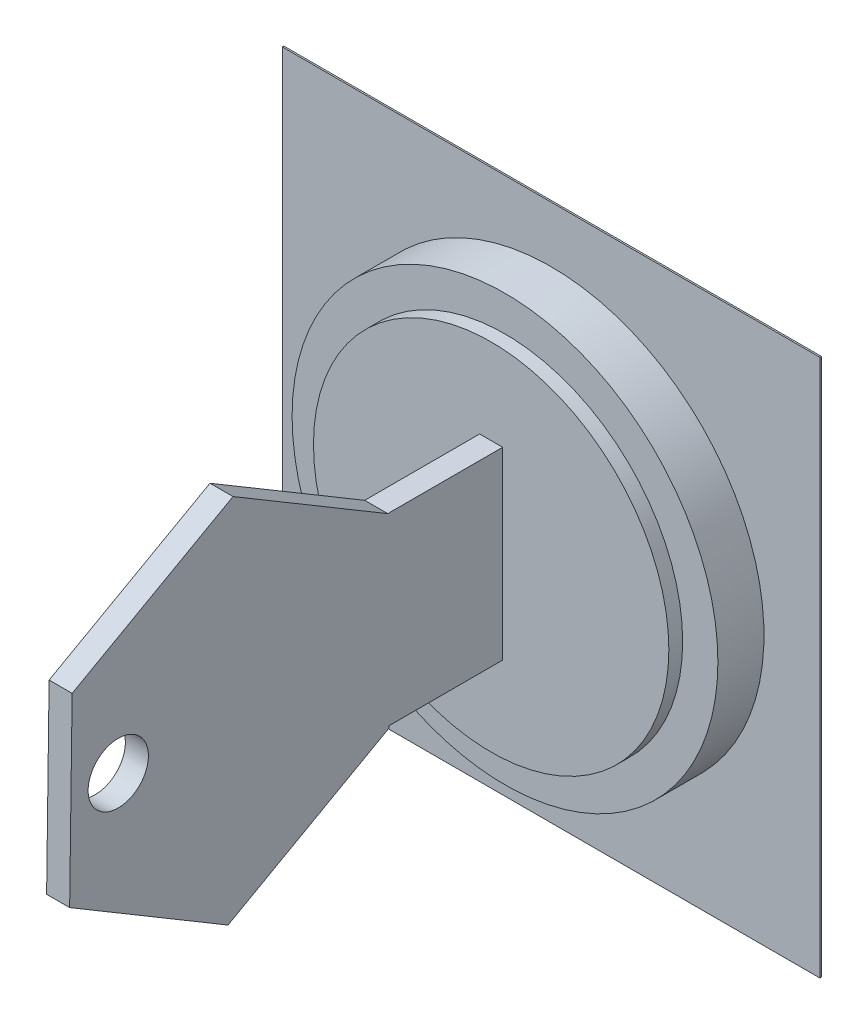
ISO-10303-21;
HEADER;
FILE_DESCRIPTION(('STEP AP214'),'2;1');
FILE_NAME('part.step','',(''),(''),'','','');
FILE_SCHEMA(('AUTOMOTIVE_DESIGN { 1 0 10303 214 1 1 1 1 }'));
ENDSEC;
DATA;
#1=APPLICATION_CONTEXT('core data for automotive mechanical design processes');
#2=APPLICATION_PROTOCOL_DEFINITION('international standard','automotive_design',2000,#1);
#3=PRODUCT_CONTEXT('',#1,'mechanical');
#4=PRODUCT('Part','Part','',(#3));
#5=PRODUCT_RELATED_PRODUCT_CATEGORY('part','',(#4));
#6=PRODUCT_DEFINITION_FORMATION('','',#4);
#7=PRODUCT_DEFINITION_CONTEXT('part definition',#1,'design');
#8=PRODUCT_DEFINITION('design','',#6,#7);
#9=PRODUCT_DEFINITION_SHAPE('','',#8);
#10=(LENGTH_UNIT() NAMED_UNIT(*) SI_UNIT(.MILLI.,.METRE.));
#11=(NAMED_UNIT(*) PLANE_ANGLE_UNIT() SI_UNIT($,.RADIAN.));
#12=(NAMED_UNIT(*) SI_UNIT($,.STERADIAN.) SOLID_ANGLE_UNIT());
#13=UNCERTAINTY_MEASURE_WITH_UNIT(LENGTH_MEASURE(1.E-05),#10,'distance_accuracy_value','');
#14=(GEOMETRIC_REPRESENTATION_CONTEXT(3) GLOBAL_UNCERTAINTY_ASSIGNED_CONTEXT((#13)) GLOBAL_UNIT_ASSIGNED_CONTEXT((#10,
#11,#12)) REPRESENTATION_CONTEXT('',''));
#15=CARTESIAN_POINT('',(0.,0.,0.));
#16=DIRECTION('',(0.,0.,1.));
#17=DIRECTION('',(1.,0.,0.));
#18=AXIS2_PLACEMENT_3D('',#15,#16,#17);
#19=CARTESIAN_POINT('',(0.,0.,4.));
#20=DIRECTION('',(0.,0.,1.));
#21=DIRECTION('',(1.,0.,0.));
#22=AXIS2_PLACEMENT_3D('',#19,#20,#21);
#23=PLANE('',#22);
#24=CARTESIAN_POINT('',(0.,0.,4.));
#25=DIRECTION('',(0.,0.,-1.));
#26=DIRECTION('',(-1.,0.,0.));
#27=AXIS2_PLACEMENT_3D('',#24,#25,#26);
#28=CIRCLE('',#27,11.5685683386056);
#29=CARTESIAN_POINT('',(-11.5685683386056,0.,4.));
#30=VERTEX_POINT('',#29);
#31=EDGE_CURVE('E203',#30,#30,#28,.T.);
#32=ORIENTED_EDGE('',*,*,#31,.F.);
#33=EDGE_LOOP('',(#32));
#34=FACE_BOUND('',#33,.T.);
#35=DIRECTION('',(-1.,0.,0.));
#36=VECTOR('',#35,1.);
#37=CARTESIAN_POINT('',(-0.75,6.,4.));
#38=LINE('',#37,#36);
#39=CARTESIAN_POINT('',(0.75,6.,4.));
#40=VERTEX_POINT('',#39);
#41=CARTESIAN_POINT('',(-0.75,6.,4.));
#42=VERTEX_POINT('',#41);
#43=EDGE_CURVE('E188',#40,#42,#38,.T.);
#44=ORIENTED_EDGE('',*,*,#43,.F.);
#45=DIRECTION('',(0.,1.,0.));
#46=VECTOR('',#45,1.);
#47=CARTESIAN_POINT('',(0.75,-6.,4.));
#48=LINE('',#47,#46);
#49=CARTESIAN_POINT('',(0.75,-6.,4.));
#50=VERTEX_POINT('',#49);
#51=EDGE_CURVE('E185',#50,#40,#48,.T.);
#52=ORIENTED_EDGE('',*,*,#51,.F.);
#53=DIRECTION('',(1.,0.,0.));
#54=VECTOR('',#53,1.);
#55=CARTESIAN_POINT('',(-0.75,-6.,4.));
#56=LINE('',#55,#54);
#57=CARTESIAN_POINT('',(-0.75,-6.,4.));
#58=VERTEX_POINT('',#57);
#59=EDGE_CURVE('E193',#58,#50,#56,.T.);
#60=ORIENTED_EDGE('',*,*,#59,.F.);
#61=DIRECTION('',(0.,-1.,0.));
#62=VECTOR('',#61,1.);
#63=CARTESIAN_POINT('',(-0.75,-6.,4.));
#64=LINE('',#63,#62);
#65=EDGE_CURVE('E190',#42,#58,#64,.T.);
#66=ORIENTED_EDGE('',*,*,#65,.F.);
#67=EDGE_LOOP('',(#44,#52,#60,#66));
#68=FACE_BOUND('',#67,.T.);
#69=ADVANCED_FACE('F35',(#34,#68),#23,.T.);
#70=CARTESIAN_POINT('',(17.5,-17.5,0.1));
#71=DIRECTION('',(-1.,0.,0.));
#72=DIRECTION('',(0.,0.,1.));
#73=AXIS2_PLACEMENT_3D('',#70,#71,#72);
#74=PLANE('',#73);
#75=DIRECTION('',(0.,1.,0.));
#76=VECTOR('',#75,1.);
#77=CARTESIAN_POINT('',(17.5,-17.5,0.));
#78=LINE('',#77,#76);
#79=CARTESIAN_POINT('',(17.5,-17.5,0.));
#80=VERTEX_POINT('',#79);
#81=CARTESIAN_POINT('',(17.5,17.5,0.));
#82=VERTEX_POINT('',#81);
#83=EDGE_CURVE('E210',#80,#82,#78,.T.);
#84=ORIENTED_EDGE('',*,*,#83,.T.);
#85=DIRECTION('',(0.,0.,-1.));
#86=VECTOR('',#85,1.);
#87=CARTESIAN_POINT('',(17.5,17.5,0.1));
#88=LINE('',#87,#86);
#89=CARTESIAN_POINT('',(17.5,17.5,0.1));
#90=VERTEX_POINT('',#89);
#91=EDGE_CURVE('E237',#90,#82,#88,.T.);
#92=ORIENTED_EDGE('',*,*,#91,.F.);
#93=DIRECTION('',(0.,1.,0.));
#94=VECTOR('',#93,1.);
#95=CARTESIAN_POINT('',(17.5,-17.5,0.1));
#96=LINE('',#95,#94);
#97=CARTESIAN_POINT('',(17.5,-17.5,0.1));
#98=VERTEX_POINT('',#97);
#99=EDGE_CURVE('E211',#98,#90,#96,.T.);
#100=ORIENTED_EDGE('',*,*,#99,.F.);
#101=DIRECTION('',(0.,0.,-1.));
#102=VECTOR('',#101,1.);
#103=CARTESIAN_POINT('',(17.5,-17.5,0.1));
#104=LINE('',#103,#102);
#105=EDGE_CURVE('E221',#98,#80,#104,.T.);
#106=ORIENTED_EDGE('',*,*,#105,.T.);
#107=EDGE_LOOP('',(#84,#92,#100,#106));
#108=FACE_BOUND('',#107,.T.);
#109=ADVANCED_FACE('F37',(#108),#74,.F.);
#110=CARTESIAN_POINT('',(-17.5,17.5,0.1));
#111=DIRECTION('',(0.,-1.,0.));
#112=DIRECTION('',(0.,0.,-1.));
#113=AXIS2_PLACEMENT_3D('',#110,#111,#112);
#114=PLANE('',#113);
#115=DIRECTION('',(-1.,0.,0.));
#116=VECTOR('',#115,1.);
#117=CARTESIAN_POINT('',(-17.5,17.5,0.));
#118=LINE('',#117,#116);
#119=CARTESIAN_POINT('',(-17.5,17.5,0.));
#120=VERTEX_POINT('',#119);
#121=EDGE_CURVE('E224',#82,#120,#118,.T.);
#122=ORIENTED_EDGE('',*,*,#121,.T.);
#123=DIRECTION('',(0.,0.,-1.));
#124=VECTOR('',#123,1.);
#125=CARTESIAN_POINT('',(-17.5,17.5,0.1));
#126=LINE('',#125,#124);
#127=CARTESIAN_POINT('',(-17.5,17.5,0.1));
#128=VERTEX_POINT('',#127);
#129=EDGE_CURVE('E234',#128,#120,#126,.T.);
#130=ORIENTED_EDGE('',*,*,#129,.F.);
#131=DIRECTION('',(-1.,0.,0.));
#132=VECTOR('',#131,1.);
#133=CARTESIAN_POINT('',(-17.5,17.5,0.1));
#134=LINE('',#133,#132);
#135=EDGE_CURVE('E214',#90,#128,#134,.T.);
#136=ORIENTED_EDGE('',*,*,#135,.F.);
#137=ORIENTED_EDGE('',*,*,#91,.T.);
#138=EDGE_LOOP('',(#122,#130,#136,#137));
#139=FACE_BOUND('',#138,.T.);
#140=ADVANCED_FACE('F316',(#139),#114,.F.);
#141=CARTESIAN_POINT('',(-17.5,-17.5,0.1));
#142=DIRECTION('',(1.,0.,0.));
#143=DIRECTION('',(0.,0.,-1.));
#144=AXIS2_PLACEMENT_3D('',#141,#142,#143);
#145=PLANE('',#144);
#146=DIRECTION('',(0.,-1.,0.));
#147=VECTOR('',#146,1.);
#148=CARTESIAN_POINT('',(-17.5,-17.5,0.));
#149=LINE('',#148,#147);
#150=CARTESIAN_POINT('',(-17.5,-17.5,0.));
#151=VERTEX_POINT('',#150);
#152=EDGE_CURVE('E226',#120,#151,#149,.T.);
#153=ORIENTED_EDGE('',*,*,#152,.T.);
#154=DIRECTION('',(0.,0.,-1.));
#155=VECTOR('',#154,1.);
#156=CARTESIAN_POINT('',(-17.5,-17.5,0.1));
#157=LINE('',#156,#155);
#158=CARTESIAN_POINT('',(-17.5,-17.5,0.1));
#159=VERTEX_POINT('',#158);
#160=EDGE_CURVE('E231',#159,#151,#157,.T.);
#161=ORIENTED_EDGE('',*,*,#160,.F.);
#162=DIRECTION('',(0.,-1.,0.));
#163=VECTOR('',#162,1.);
#164=CARTESIAN_POINT('',(-17.5,-17.5,0.1));
#165=LINE('',#164,#163);
#166=EDGE_CURVE('E217',#128,#159,#165,.T.);
#167=ORIENTED_EDGE('',*,*,#166,.F.);
#168=ORIENTED_EDGE('',*,*,#129,.T.);
#169=EDGE_LOOP('',(#153,#161,#167,#168));
#170=FACE_BOUND('',#169,.T.);
#171=ADVANCED_FACE('F313',(#170),#145,.F.);
#172=CARTESIAN_POINT('',(-17.5,-17.5,0.1));
#173=DIRECTION('',(0.,1.,0.));
#174=DIRECTION('',(0.,0.,1.));
#175=AXIS2_PLACEMENT_3D('',#172,#173,#174);
#176=PLANE('',#175);
#177=DIRECTION('',(1.,0.,0.));
#178=VECTOR('',#177,1.);
#179=CARTESIAN_POINT('',(-17.5,-17.5,0.));
#180=LINE('',#179,#178);
#181=EDGE_CURVE('E215',#151,#80,#180,.T.);
#182=ORIENTED_EDGE('',*,*,#181,.T.);
#183=ORIENTED_EDGE('',*,*,#105,.F.);
#184=DIRECTION('',(1.,0.,0.));
#185=VECTOR('',#184,1.);
#186=CARTESIAN_POINT('',(-17.5,-17.5,0.1));
#187=LINE('',#186,#185);
#188=EDGE_CURVE('E219',#159,#98,#187,.T.);
#189=ORIENTED_EDGE('',*,*,#188,.F.);
#190=ORIENTED_EDGE('',*,*,#160,.T.);
#191=EDGE_LOOP('',(#182,#183,#189,#190));
#192=FACE_BOUND('',#191,.T.);
#193=ADVANCED_FACE('F306',(#192),#176,.F.);
#194=CARTESIAN_POINT('',(0.,0.,0.1));
#195=DIRECTION('',(0.,0.,-1.));
#196=DIRECTION('',(-1.,0.,0.));
#197=AXIS2_PLACEMENT_3D('',#194,#195,#196);
#198=PLANE('',#197);
#199=CARTESIAN_POINT('',(0.,0.,0.0999999999999998));
#200=DIRECTION('',(0.,0.,-1.));
#201=DIRECTION('',(-1.,0.,0.));
#202=AXIS2_PLACEMENT_3D('',#199,#200,#201);
#203=CIRCLE('',#202,13.8612305493775);
#204=CARTESIAN_POINT('',(-13.8612305493775,0.,0.0999999999999998));
#205=VERTEX_POINT('',#204);
#206=EDGE_CURVE('E43',#205,#205,#203,.F.);
#207=ORIENTED_EDGE('',*,*,#206,.F.);
#208=EDGE_LOOP('',(#207));
#209=FACE_BOUND('',#208,.T.);
#210=ORIENTED_EDGE('',*,*,#99,.T.);
#211=ORIENTED_EDGE('',*,*,#135,.T.);
#212=ORIENTED_EDGE('',*,*,#166,.T.);
#213=ORIENTED_EDGE('',*,*,#188,.T.);
#214=EDGE_LOOP('',(#210,#211,#212,#213));
#215=FACE_BOUND('',#214,.T.);
#216=ADVANCED_FACE('F303',(#209,#215),#198,.F.);
#217=CARTESIAN_POINT('',(0.,0.,0.));
#218=DIRECTION('',(0.,0.,-1.));
#219=DIRECTION('',(-1.,0.,0.));
#220=AXIS2_PLACEMENT_3D('',#217,#218,#219);
#221=PLANE('',#220);
#222=ORIENTED_EDGE('',*,*,#83,.F.);
#223=ORIENTED_EDGE('',*,*,#181,.F.);
#224=ORIENTED_EDGE('',*,*,#152,.F.);
#225=ORIENTED_EDGE('',*,*,#121,.F.);
#226=EDGE_LOOP('',(#222,#223,#224,#225));
#227=FACE_BOUND('',#226,.T.);
#228=ADVANCED_FACE('F301',(#227),#221,.T.);
#229=CARTESIAN_POINT('',(0.,0.,3.1));
#230=DIRECTION('',(0.,0.,-1.));
#231=DIRECTION('',(-1.,0.,0.));
#232=AXIS2_PLACEMENT_3D('',#229,#230,#231);
#233=CYLINDRICAL_SURFACE('',#232,13.8612305493775);
#234=CARTESIAN_POINT('',(0.,0.,3.1));
#235=DIRECTION('',(0.,0.,1.));
#236=DIRECTION('',(1.,0.,0.));
#237=AXIS2_PLACEMENT_3D('',#234,#235,#236);
#238=CIRCLE('',#237,13.8612305493775);
#239=CARTESIAN_POINT('',(13.8612305493775,0.,3.1));
#240=VERTEX_POINT('',#239);
#241=EDGE_CURVE('E207',#240,#240,#238,.T.);
#242=ORIENTED_EDGE('',*,*,#241,.F.);
#243=EDGE_LOOP('',(#242));
#244=FACE_BOUND('',#243,.T.);
#245=ORIENTED_EDGE('',*,*,#206,.T.);
#246=EDGE_LOOP('',(#245));
#247=FACE_BOUND('',#246,.T.);
#248=ADVANCED_FACE('F298',(#244,#247),#233,.T.);
#249=CARTESIAN_POINT('',(0.,0.,3.1));
#250=DIRECTION('',(0.,0.,1.));
#251=DIRECTION('',(1.,0.,0.));
#252=AXIS2_PLACEMENT_3D('',#249,#250,#251);
#253=PLANE('',#252);
#254=CARTESIAN_POINT('',(0.,0.,3.1));
#255=DIRECTION('',(0.,0.,1.));
#256=DIRECTION('',(1.,0.,0.));
#257=AXIS2_PLACEMENT_3D('',#254,#255,#256);
#258=CIRCLE('',#257,11.5685683386056);
#259=CARTESIAN_POINT('',(11.5685683386056,0.,3.1));
#260=VERTEX_POINT('',#259);
#261=EDGE_CURVE('E206',#260,#260,#258,.F.);
#262=ORIENTED_EDGE('',*,*,#261,.T.);
#263=EDGE_LOOP('',(#262));
#264=FACE_BOUND('',#263,.T.);
#265=ORIENTED_EDGE('',*,*,#241,.T.);
#266=EDGE_LOOP('',(#265));
#267=FACE_BOUND('',#266,.T.);
#268=ADVANCED_FACE('F244',(#264,#267),#253,.T.);
#269=CARTESIAN_POINT('',(0.,0.,0.));
#270=DIRECTION('',(0.,0.,1.));
#271=DIRECTION('',(1.,0.,0.));
#272=AXIS2_PLACEMENT_3D('',#269,#270,#271);
#273=CYLINDRICAL_SURFACE('',#272,11.5685683386056);
#274=ORIENTED_EDGE('',*,*,#261,.F.);
#275=EDGE_LOOP('',(#274));
#276=FACE_BOUND('',#275,.T.);
#277=ORIENTED_EDGE('',*,*,#31,.T.);
#278=EDGE_LOOP('',(#277));
#279=FACE_BOUND('',#278,.T.);
#280=ADVANCED_FACE('F247',(#276,#279),#273,.T.);
#281=CARTESIAN_POINT('',(0.75,-6.,14.));
#282=DIRECTION('',(-1.,0.,0.));
#283=DIRECTION('',(0.,0.,1.));
#284=AXIS2_PLACEMENT_3D('',#281,#282,#283);
#285=PLANE('',#284);
#286=CARTESIAN_POINT('',(0.750000000000001,0.140514783402148,29.029224944706));
#287=DIRECTION('',(-1.,0.,0.));
#288=DIRECTION('',(0.,0.,1.));
#289=AXIS2_PLACEMENT_3D('',#286,#287,#288);
#290=CIRCLE('',#289,1.96364554222285);
#291=CARTESIAN_POINT('',(0.750000000000001,0.140514783402148,30.9928704869289));
#292=VERTEX_POINT('',#291);
#293=EDGE_CURVE('E165',#292,#292,#290,.T.);
#294=ORIENTED_EDGE('',*,*,#293,.T.);
#295=EDGE_LOOP('',(#294));
#296=FACE_BOUND('',#295,.T.);
#297=DIRECTION('',(0.,0.,-1.));
#298=VECTOR('',#297,1.);
#299=CARTESIAN_POINT('',(0.75,6.,14.));
#300=LINE('',#299,#298);
#301=CARTESIAN_POINT('',(0.75,6.,11.482558374945));
#302=VERTEX_POINT('',#301);
#303=EDGE_CURVE('E201',#302,#40,#300,.T.);
#304=ORIENTED_EDGE('',*,*,#303,.F.);
#305=DIRECTION('',(0.,-0.511662796693405,-0.859186349100056));
#306=VECTOR('',#305,1.);
#307=CARTESIAN_POINT('',(0.75,12.,21.5577839491221));
#308=LINE('',#307,#306);
#309=CARTESIAN_POINT('',(0.75,12.,21.5577839491221));
#310=VERTEX_POINT('',#309);
#311=EDGE_CURVE('E137',#310,#302,#308,.T.);
#312=ORIENTED_EDGE('',*,*,#311,.F.);
#313=DIRECTION('',(0.,0.488245806558751,-0.872706154657909));
#314=VECTOR('',#313,1.);
#315=CARTESIAN_POINT('',(0.75,6.14051478340215,32.0312150425577));
#316=LINE('',#315,#314);
#317=CARTESIAN_POINT('',(0.75,6.14051478340215,32.0312150425577));
#318=VERTEX_POINT('',#317);
#319=EDGE_CURVE('E145',#318,#310,#316,.T.);
#320=ORIENTED_EDGE('',*,*,#319,.F.);
#321=DIRECTION('',(0.,0.999908603252156,-0.0135198055578532));
#322=VECTOR('',#321,1.);
#323=CARTESIAN_POINT('',(0.75,-5.85948521659785,32.1934675386024));
#324=LINE('',#323,#322);
#325=CARTESIAN_POINT('',(0.75,-5.85948521659785,32.1934675386024));
#326=VERTEX_POINT('',#325);
#327=EDGE_CURVE('E153',#326,#318,#324,.T.);
#328=ORIENTED_EDGE('',*,*,#327,.F.);
#329=DIRECTION('',(0.,0.511662796693405,0.859186349100056));
#330=VECTOR('',#329,1.);
#331=CARTESIAN_POINT('',(0.75,-12.,21.8822889412115));
#332=LINE('',#331,#330);
#333=CARTESIAN_POINT('',(0.75,-12.,21.8822889412115));
#334=VERTEX_POINT('',#333);
#335=EDGE_CURVE('E151',#334,#326,#332,.T.);
#336=ORIENTED_EDGE('',*,*,#335,.F.);
#337=DIRECTION('',(0.,-0.488245806558751,0.872706154657909));
#338=VECTOR('',#337,1.);
#339=CARTESIAN_POINT('',(0.75,-6.14051478340215,11.4088578477759));
#340=LINE('',#339,#338);
#341=CARTESIAN_POINT('',(0.75,-6.14051478340215,11.4088578477759));
#342=VERTEX_POINT('',#341);
#343=EDGE_CURVE('E136',#342,#334,#340,.T.);
#344=ORIENTED_EDGE('',*,*,#343,.F.);
#345=DIRECTION('',(0.,-0.999908603252156,0.0135198055578531));
#346=VECTOR('',#345,1.);
#347=CARTESIAN_POINT('',(0.75,5.85948521659785,11.2466053517311));
#348=LINE('',#347,#346);
#349=CARTESIAN_POINT('',(0.75,-6.,11.406957941581));
#350=VERTEX_POINT('',#349);
#351=EDGE_CURVE('E128',#350,#342,#348,.T.);
#352=ORIENTED_EDGE('',*,*,#351,.F.);
#353=DIRECTION('',(0.,0.,-1.));
#354=VECTOR('',#353,1.);
#355=CARTESIAN_POINT('',(0.75,-6.,14.));
#356=LINE('',#355,#354);
#357=EDGE_CURVE('E196',#350,#50,#356,.T.);
#358=ORIENTED_EDGE('',*,*,#357,.T.);
#359=ORIENTED_EDGE('',*,*,#51,.T.);
#360=EDGE_LOOP('',(#304,#312,#320,#328,#336,#344,#352,#358,#359));
#361=FACE_BOUND('',#360,.T.);
#362=ADVANCED_FACE('F148',(#296,#361),#285,.F.);
#363=CARTESIAN_POINT('',(-0.75,6.,14.));
#364=DIRECTION('',(0.,-1.,0.));
#365=DIRECTION('',(0.,0.,-1.));
#366=AXIS2_PLACEMENT_3D('',#363,#364,#365);
#367=PLANE('',#366);
#368=DIRECTION('',(0.,0.,-1.));
#369=VECTOR('',#368,1.);
#370=CARTESIAN_POINT('',(-0.75,6.,14.));
#371=LINE('',#370,#369);
#372=CARTESIAN_POINT('',(-0.75,6.,11.482558374945));
#373=VERTEX_POINT('',#372);
#374=EDGE_CURVE('E55',#373,#42,#371,.T.);
#375=ORIENTED_EDGE('',*,*,#374,.F.);
#376=DIRECTION('',(1.,0.,0.));
#377=VECTOR('',#376,1.);
#378=CARTESIAN_POINT('',(-0.75,6.,11.482558374945));
#379=LINE('',#378,#377);
#380=EDGE_CURVE('E50',#373,#302,#379,.T.);
#381=ORIENTED_EDGE('',*,*,#380,.T.);
#382=ORIENTED_EDGE('',*,*,#303,.T.);
#383=ORIENTED_EDGE('',*,*,#43,.T.);
#384=EDGE_LOOP('',(#375,#381,#382,#383));
#385=FACE_BOUND('',#384,.T.);
#386=ADVANCED_FACE('F260',(#385),#367,.F.);
#387=CARTESIAN_POINT('',(-0.75,-6.,14.));
#388=DIRECTION('',(1.,0.,0.));
#389=DIRECTION('',(0.,0.,-1.));
#390=AXIS2_PLACEMENT_3D('',#387,#388,#389);
#391=PLANE('',#390);
#392=CARTESIAN_POINT('',(-0.75,0.140514783402148,29.029224944706));
#393=DIRECTION('',(-1.,0.,0.));
#394=DIRECTION('',(0.,0.,1.));
#395=AXIS2_PLACEMENT_3D('',#392,#393,#394);
#396=CIRCLE('',#395,1.96364554222285);
#397=CARTESIAN_POINT('',(-0.75,0.140514783402148,30.9928704869289));
#398=VERTEX_POINT('',#397);
#399=EDGE_CURVE('E276',#398,#398,#396,.T.);
#400=ORIENTED_EDGE('',*,*,#399,.F.);
#401=EDGE_LOOP('',(#400));
#402=FACE_BOUND('',#401,.T.);
#403=DIRECTION('',(0.,-0.511662796693405,-0.859186349100056));
#404=VECTOR('',#403,1.);
#405=CARTESIAN_POINT('',(-0.75,12.,21.5577839491221));
#406=LINE('',#405,#404);
#407=CARTESIAN_POINT('',(-0.75,12.,21.5577839491221));
#408=VERTEX_POINT('',#407);
#409=EDGE_CURVE('E161',#408,#373,#406,.T.);
#410=ORIENTED_EDGE('',*,*,#409,.T.);
#411=ORIENTED_EDGE('',*,*,#374,.T.);
#412=ORIENTED_EDGE('',*,*,#65,.T.);
#413=DIRECTION('',(0.,0.,-1.));
#414=VECTOR('',#413,1.);
#415=CARTESIAN_POINT('',(-0.75,-6.,14.));
#416=LINE('',#415,#414);
#417=CARTESIAN_POINT('',(-0.75,-6.,11.406957941581));
#418=VERTEX_POINT('',#417);
#419=EDGE_CURVE('E198',#418,#58,#416,.T.);
#420=ORIENTED_EDGE('',*,*,#419,.F.);
#421=DIRECTION('',(0.,-0.999908603252156,0.0135198055578531));
#422=VECTOR('',#421,1.);
#423=CARTESIAN_POINT('',(-0.75,5.85948521659785,11.2466053517311));
#424=LINE('',#423,#422);
#425=CARTESIAN_POINT('',(-0.75,-6.14051478340215,11.4088578477759));
#426=VERTEX_POINT('',#425);
#427=EDGE_CURVE('E164',#418,#426,#424,.T.);
#428=ORIENTED_EDGE('',*,*,#427,.T.);
#429=DIRECTION('',(0.,-0.488245806558751,0.872706154657909));
#430=VECTOR('',#429,1.);
#431=CARTESIAN_POINT('',(-0.75,-6.14051478340215,11.4088578477759));
#432=LINE('',#431,#430);
#433=CARTESIAN_POINT('',(-0.75,-12.,21.8822889412115));
#434=VERTEX_POINT('',#433);
#435=EDGE_CURVE('E143',#426,#434,#432,.T.);
#436=ORIENTED_EDGE('',*,*,#435,.T.);
#437=DIRECTION('',(0.,0.511662796693405,0.859186349100056));
#438=VECTOR('',#437,1.);
#439=CARTESIAN_POINT('',(-0.75,-12.,21.8822889412115));
#440=LINE('',#439,#438);
#441=CARTESIAN_POINT('',(-0.75,-5.85948521659785,32.1934675386024));
#442=VERTEX_POINT('',#441);
#443=EDGE_CURVE('E168',#434,#442,#440,.T.);
#444=ORIENTED_EDGE('',*,*,#443,.T.);
#445=DIRECTION('',(0.,0.999908603252156,-0.0135198055578532));
#446=VECTOR('',#445,1.);
#447=CARTESIAN_POINT('',(-0.75,-5.85948521659785,32.1934675386024));
#448=LINE('',#447,#446);
#449=CARTESIAN_POINT('',(-0.75,6.14051478340215,32.0312150425577));
#450=VERTEX_POINT('',#449);
#451=EDGE_CURVE('E171',#442,#450,#448,.T.);
#452=ORIENTED_EDGE('',*,*,#451,.T.);
#453=DIRECTION('',(0.,0.488245806558751,-0.872706154657909));
#454=VECTOR('',#453,1.);
#455=CARTESIAN_POINT('',(-0.75,6.14051478340215,32.0312150425577));
#456=LINE('',#455,#454);
#457=EDGE_CURVE('E174',#450,#408,#456,.T.);
#458=ORIENTED_EDGE('',*,*,#457,.T.);
#459=EDGE_LOOP('',(#410,#411,#412,#420,#428,#436,#444,#452,#458));
#460=FACE_BOUND('',#459,.T.);
#461=ADVANCED_FACE('F267',(#402,#460),#391,.F.);
#462=CARTESIAN_POINT('',(-0.75,-6.,14.));
#463=DIRECTION('',(0.,1.,0.));
#464=DIRECTION('',(0.,0.,1.));
#465=AXIS2_PLACEMENT_3D('',#462,#463,#464);
#466=PLANE('',#465);
#467=ORIENTED_EDGE('',*,*,#357,.F.);
#468=DIRECTION('',(-1.,0.,0.));
#469=VECTOR('',#468,1.);
#470=CARTESIAN_POINT('',(-0.75,-6.,11.406957941581));
#471=LINE('',#470,#469);
#472=EDGE_CURVE('E12',#350,#418,#471,.T.);
#473=ORIENTED_EDGE('',*,*,#472,.T.);
#474=ORIENTED_EDGE('',*,*,#419,.T.);
#475=ORIENTED_EDGE('',*,*,#59,.T.);
#476=EDGE_LOOP('',(#467,#473,#474,#475));
#477=FACE_BOUND('',#476,.T.);
#478=ADVANCED_FACE('F264',(#477),#466,.F.);
#479=CARTESIAN_POINT('',(0.75,12.,21.5577839491221));
#480=DIRECTION('',(0.,0.859186349100056,-0.511662796693405));
#481=DIRECTION('',(0.,0.511662796693405,0.859186349100056));
#482=AXIS2_PLACEMENT_3D('',#479,#480,#481);
#483=PLANE('',#482);
#484=ORIENTED_EDGE('',*,*,#380,.F.);
#485=ORIENTED_EDGE('',*,*,#409,.F.);
#486=DIRECTION('',(-1.,0.,0.));
#487=VECTOR('',#486,1.);
#488=CARTESIAN_POINT('',(0.75,12.,21.5577839491221));
#489=LINE('',#488,#487);
#490=EDGE_CURVE('E177',#310,#408,#489,.T.);
#491=ORIENTED_EDGE('',*,*,#490,.F.);
#492=ORIENTED_EDGE('',*,*,#311,.T.);
#493=EDGE_LOOP('',(#484,#485,#491,#492));
#494=FACE_BOUND('',#493,.T.);
#495=ADVANCED_FACE('F271',(#494),#483,.T.);
#496=CARTESIAN_POINT('',(0.75,5.85948521659785,11.2466053517311));
#497=DIRECTION('',(0.,-0.0135198055578531,-0.999908603252156));
#498=DIRECTION('',(0.,0.999908603252156,-0.0135198055578531));
#499=AXIS2_PLACEMENT_3D('',#496,#497,#498);
#500=PLANE('',#499);
#501=ORIENTED_EDGE('',*,*,#472,.F.);
#502=ORIENTED_EDGE('',*,*,#351,.T.);
#503=DIRECTION('',(-1.,0.,0.));
#504=VECTOR('',#503,1.);
#505=CARTESIAN_POINT('',(0.75,-6.14051478340215,11.4088578477759));
#506=LINE('',#505,#504);
#507=EDGE_CURVE('E132',#342,#426,#506,.T.);
#508=ORIENTED_EDGE('',*,*,#507,.T.);
#509=ORIENTED_EDGE('',*,*,#427,.F.);
#510=EDGE_LOOP('',(#501,#502,#508,#509));
#511=FACE_BOUND('',#510,.T.);
#512=ADVANCED_FACE('F130',(#511),#500,.T.);
#513=CARTESIAN_POINT('',(0.75,6.14051478340215,32.0312150425577));
#514=DIRECTION('',(0.,0.872706154657909,0.488245806558751));
#515=DIRECTION('',(0.,-0.488245806558751,0.872706154657909));
#516=AXIS2_PLACEMENT_3D('',#513,#514,#515);
#517=PLANE('',#516);
#518=ORIENTED_EDGE('',*,*,#457,.F.);
#519=DIRECTION('',(-1.,0.,0.));
#520=VECTOR('',#519,1.);
#521=CARTESIAN_POINT('',(0.75,6.14051478340215,32.0312150425577));
#522=LINE('',#521,#520);
#523=EDGE_CURVE('E179',#318,#450,#522,.T.);
#524=ORIENTED_EDGE('',*,*,#523,.F.);
#525=ORIENTED_EDGE('',*,*,#319,.T.);
#526=ORIENTED_EDGE('',*,*,#490,.T.);
#527=EDGE_LOOP('',(#518,#524,#525,#526));
#528=FACE_BOUND('',#527,.T.);
#529=ADVANCED_FACE('F359',(#528),#517,.T.);
#530=CARTESIAN_POINT('',(0.75,-5.85948521659785,32.1934675386024));
#531=DIRECTION('',(0.,0.0135198055578532,0.999908603252156));
#532=DIRECTION('',(0.,-0.999908603252156,0.0135198055578532));
#533=AXIS2_PLACEMENT_3D('',#530,#531,#532);
#534=PLANE('',#533);
#535=ORIENTED_EDGE('',*,*,#451,.F.);
#536=DIRECTION('',(-1.,0.,0.));
#537=VECTOR('',#536,1.);
#538=CARTESIAN_POINT('',(0.75,-5.85948521659785,32.1934675386024));
#539=LINE('',#538,#537);
#540=EDGE_CURVE('E181',#326,#442,#539,.T.);
#541=ORIENTED_EDGE('',*,*,#540,.F.);
#542=ORIENTED_EDGE('',*,*,#327,.T.);
#543=ORIENTED_EDGE('',*,*,#523,.T.);
#544=EDGE_LOOP('',(#535,#541,#542,#543));
#545=FACE_BOUND('',#544,.T.);
#546=ADVANCED_FACE('F353',(#545),#534,.T.);
#547=CARTESIAN_POINT('',(0.75,-12.,21.8822889412115));
#548=DIRECTION('',(0.,-0.859186349100056,0.511662796693405));
#549=DIRECTION('',(0.,-0.511662796693405,-0.859186349100056));
#550=AXIS2_PLACEMENT_3D('',#547,#548,#549);
#551=PLANE('',#550);
#552=ORIENTED_EDGE('',*,*,#443,.F.);
#553=DIRECTION('',(-1.,0.,0.));
#554=VECTOR('',#553,1.);
#555=CARTESIAN_POINT('',(0.75,-12.,21.8822889412115));
#556=LINE('',#555,#554);
#557=EDGE_CURVE('E144',#334,#434,#556,.T.);
#558=ORIENTED_EDGE('',*,*,#557,.F.);
#559=ORIENTED_EDGE('',*,*,#335,.T.);
#560=ORIENTED_EDGE('',*,*,#540,.T.);
#561=EDGE_LOOP('',(#552,#558,#559,#560));
#562=FACE_BOUND('',#561,.T.);
#563=ADVANCED_FACE('F358',(#562),#551,.T.);
#564=CARTESIAN_POINT('',(0.75,-6.14051478340215,11.4088578477759));
#565=DIRECTION('',(0.,-0.872706154657909,-0.488245806558751));
#566=DIRECTION('',(0.,0.488245806558751,-0.872706154657909));
#567=AXIS2_PLACEMENT_3D('',#564,#565,#566);
#568=PLANE('',#567);
#569=ORIENTED_EDGE('',*,*,#435,.F.);
#570=ORIENTED_EDGE('',*,*,#507,.F.);
#571=ORIENTED_EDGE('',*,*,#343,.T.);
#572=ORIENTED_EDGE('',*,*,#557,.T.);
#573=EDGE_LOOP('',(#569,#570,#571,#572));
#574=FACE_BOUND('',#573,.T.);
#575=ADVANCED_FACE('F141',(#574),#568,.T.);
#576=CARTESIAN_POINT('',(17.5,0.140514783402148,29.029224944706));
#577=DIRECTION('',(-1.,0.,0.));
#578=DIRECTION('',(0.,0.,1.));
#579=AXIS2_PLACEMENT_3D('',#576,#577,#578);
#580=CYLINDRICAL_SURFACE('',#579,1.96364554222285);
#581=ORIENTED_EDGE('',*,*,#399,.T.);
#582=EDGE_LOOP('',(#581));
#583=FACE_BOUND('',#582,.T.);
#584=ORIENTED_EDGE('',*,*,#293,.F.);
#585=EDGE_LOOP('',(#584));
#586=FACE_BOUND('',#585,.T.);
#587=ADVANCED_FACE('F280',(#583,#586),#580,.F.);
#588=CLOSED_SHELL('',(#69,#109,#140,#171,#193,#216,#228,#248,#268,#280,#362,#386,#461,#478,#495,
#512,#529,#546,#563,#575,#587));
#589=MANIFOLD_SOLID_BREP('B2',#588);
#590=ADVANCED_BREP_SHAPE_REPRESENTATION('',(#18,#589),#14);
#591=SHAPE_DEFINITION_REPRESENTATION(#9,#590);
ENDSEC;
END-ISO-10303-21;
